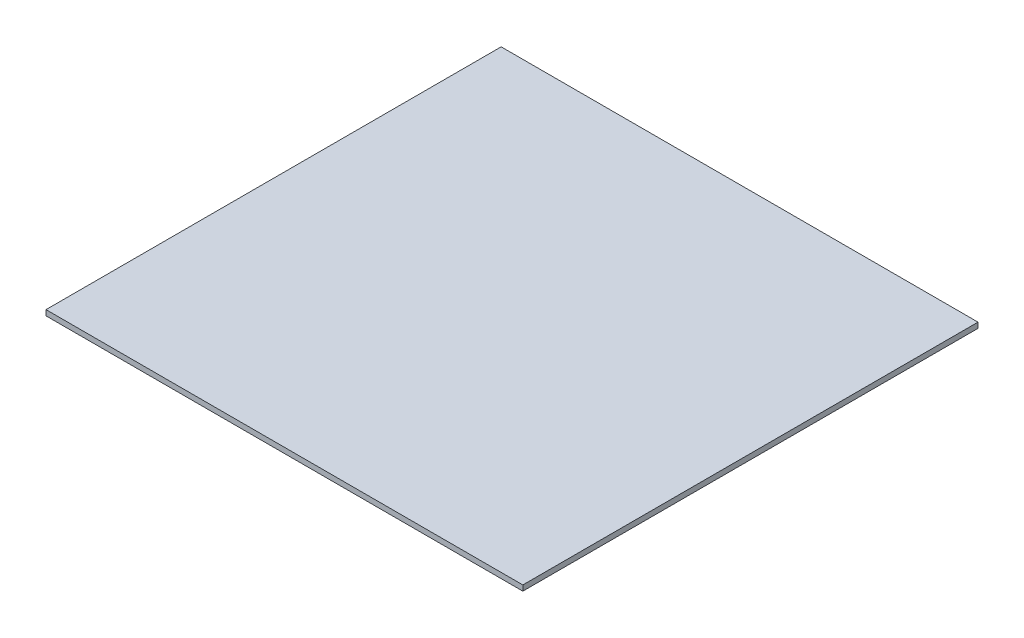
ISO-10303-21;
HEADER;
FILE_DESCRIPTION(('STEP AP214'),'2;1');
FILE_NAME('part.step','',(''),(''),'','','');
FILE_SCHEMA(('AUTOMOTIVE_DESIGN { 1 0 10303 214 1 1 1 1 }'));
ENDSEC;
DATA;
#1=APPLICATION_CONTEXT('core data for automotive mechanical design processes');
#2=APPLICATION_PROTOCOL_DEFINITION('international standard','automotive_design',2000,#1);
#3=PRODUCT_CONTEXT('',#1,'mechanical');
#4=PRODUCT('Part','Part','',(#3));
#5=PRODUCT_RELATED_PRODUCT_CATEGORY('part','',(#4));
#6=PRODUCT_DEFINITION_FORMATION('','',#4);
#7=PRODUCT_DEFINITION_CONTEXT('part definition',#1,'design');
#8=PRODUCT_DEFINITION('design','',#6,#7);
#9=PRODUCT_DEFINITION_SHAPE('','',#8);
#10=(LENGTH_UNIT() NAMED_UNIT(*) SI_UNIT(.MILLI.,.METRE.));
#11=(NAMED_UNIT(*) PLANE_ANGLE_UNIT() SI_UNIT($,.RADIAN.));
#12=(NAMED_UNIT(*) SI_UNIT($,.STERADIAN.) SOLID_ANGLE_UNIT());
#13=UNCERTAINTY_MEASURE_WITH_UNIT(LENGTH_MEASURE(1.E-05),#10,'distance_accuracy_value','');
#14=(GEOMETRIC_REPRESENTATION_CONTEXT(3) GLOBAL_UNCERTAINTY_ASSIGNED_CONTEXT((#13)) GLOBAL_UNIT_ASSIGNED_CONTEXT((#10,
#11,#12)) REPRESENTATION_CONTEXT('',''));
#15=CARTESIAN_POINT('',(0.,0.,0.));
#16=DIRECTION('',(0.,0.,1.));
#17=DIRECTION('',(1.,0.,0.));
#18=AXIS2_PLACEMENT_3D('',#15,#16,#17);
#19=CARTESIAN_POINT('',(279.4,6.35,266.7));
#20=DIRECTION('',(-1.,0.,0.));
#21=DIRECTION('',(0.,0.,1.));
#22=AXIS2_PLACEMENT_3D('',#19,#20,#21);
#23=PLANE('',#22);
#24=DIRECTION('',(0.,0.,-1.));
#25=VECTOR('',#24,1.);
#26=CARTESIAN_POINT('',(279.4,0.,266.7));
#27=LINE('',#26,#25);
#28=CARTESIAN_POINT('',(279.4,0.,266.7));
#29=VERTEX_POINT('',#28);
#30=CARTESIAN_POINT('',(279.4,0.,-266.7));
#31=VERTEX_POINT('',#30);
#32=EDGE_CURVE('E111',#29,#31,#27,.T.);
#33=ORIENTED_EDGE('',*,*,#32,.T.);
#34=DIRECTION('',(0.,-1.,0.));
#35=VECTOR('',#34,1.);
#36=CARTESIAN_POINT('',(279.4,6.35,-266.7));
#37=LINE('',#36,#35);
#38=CARTESIAN_POINT('',(279.4,6.35,-266.7));
#39=VERTEX_POINT('',#38);
#40=EDGE_CURVE('E11',#39,#31,#37,.T.);
#41=ORIENTED_EDGE('',*,*,#40,.F.);
#42=DIRECTION('',(0.,0.,-1.));
#43=VECTOR('',#42,1.);
#44=CARTESIAN_POINT('',(279.4,6.35,266.7));
#45=LINE('',#44,#43);
#46=CARTESIAN_POINT('',(279.4,6.35,266.7));
#47=VERTEX_POINT('',#46);
#48=EDGE_CURVE('E95',#47,#39,#45,.T.);
#49=ORIENTED_EDGE('',*,*,#48,.F.);
#50=DIRECTION('',(0.,-1.,0.));
#51=VECTOR('',#50,1.);
#52=CARTESIAN_POINT('',(279.4,6.35,266.7));
#53=LINE('',#52,#51);
#54=EDGE_CURVE('E107',#47,#29,#53,.T.);
#55=ORIENTED_EDGE('',*,*,#54,.T.);
#56=EDGE_LOOP('',(#33,#41,#49,#55));
#57=FACE_BOUND('',#56,.T.);
#58=ADVANCED_FACE('F43',(#57),#23,.F.);
#59=CARTESIAN_POINT('',(-279.4,6.35,-266.7));
#60=DIRECTION('',(0.,0.,1.));
#61=DIRECTION('',(1.,0.,0.));
#62=AXIS2_PLACEMENT_3D('',#59,#60,#61);
#63=PLANE('',#62);
#64=DIRECTION('',(-1.,0.,0.));
#65=VECTOR('',#64,1.);
#66=CARTESIAN_POINT('',(-279.4,0.,-266.7));
#67=LINE('',#66,#65);
#68=CARTESIAN_POINT('',(-279.4,0.,-266.7));
#69=VERTEX_POINT('',#68);
#70=EDGE_CURVE('E100',#31,#69,#67,.T.);
#71=ORIENTED_EDGE('',*,*,#70,.T.);
#72=DIRECTION('',(0.,-1.,0.));
#73=VECTOR('',#72,1.);
#74=CARTESIAN_POINT('',(-279.4,6.35,-266.7));
#75=LINE('',#74,#73);
#76=CARTESIAN_POINT('',(-279.4,6.35,-266.7));
#77=VERTEX_POINT('',#76);
#78=EDGE_CURVE('E52',#77,#69,#75,.T.);
#79=ORIENTED_EDGE('',*,*,#78,.F.);
#80=DIRECTION('',(-1.,0.,0.));
#81=VECTOR('',#80,1.);
#82=CARTESIAN_POINT('',(-279.4,6.35,-266.7));
#83=LINE('',#82,#81);
#84=EDGE_CURVE('E90',#39,#77,#83,.T.);
#85=ORIENTED_EDGE('',*,*,#84,.F.);
#86=ORIENTED_EDGE('',*,*,#40,.T.);
#87=EDGE_LOOP('',(#71,#79,#85,#86));
#88=FACE_BOUND('',#87,.T.);
#89=ADVANCED_FACE('F99',(#88),#63,.F.);
#90=CARTESIAN_POINT('',(-279.4,6.35,266.7));
#91=DIRECTION('',(1.,0.,0.));
#92=DIRECTION('',(0.,0.,-1.));
#93=AXIS2_PLACEMENT_3D('',#90,#91,#92);
#94=PLANE('',#93);
#95=DIRECTION('',(0.,0.,1.));
#96=VECTOR('',#95,1.);
#97=CARTESIAN_POINT('',(-279.4,0.,266.7));
#98=LINE('',#97,#96);
#99=CARTESIAN_POINT('',(-279.4,0.,266.7));
#100=VERTEX_POINT('',#99);
#101=EDGE_CURVE('E77',#69,#100,#98,.T.);
#102=ORIENTED_EDGE('',*,*,#101,.T.);
#103=DIRECTION('',(0.,-1.,0.));
#104=VECTOR('',#103,1.);
#105=CARTESIAN_POINT('',(-279.4,6.35,266.7));
#106=LINE('',#105,#104);
#107=CARTESIAN_POINT('',(-279.4,6.35,266.7));
#108=VERTEX_POINT('',#107);
#109=EDGE_CURVE('E102',#108,#100,#106,.T.);
#110=ORIENTED_EDGE('',*,*,#109,.F.);
#111=DIRECTION('',(0.,0.,1.));
#112=VECTOR('',#111,1.);
#113=CARTESIAN_POINT('',(-279.4,6.35,266.7));
#114=LINE('',#113,#112);
#115=EDGE_CURVE('E93',#77,#108,#114,.T.);
#116=ORIENTED_EDGE('',*,*,#115,.F.);
#117=ORIENTED_EDGE('',*,*,#78,.T.);
#118=EDGE_LOOP('',(#102,#110,#116,#117));
#119=FACE_BOUND('',#118,.T.);
#120=ADVANCED_FACE('F103',(#119),#94,.F.);
#121=CARTESIAN_POINT('',(-279.4,6.35,266.7));
#122=DIRECTION('',(0.,0.,-1.));
#123=DIRECTION('',(-1.,0.,0.));
#124=AXIS2_PLACEMENT_3D('',#121,#122,#123);
#125=PLANE('',#124);
#126=DIRECTION('',(1.,0.,0.));
#127=VECTOR('',#126,1.);
#128=CARTESIAN_POINT('',(-279.4,0.,266.7));
#129=LINE('',#128,#127);
#130=EDGE_CURVE('E83',#100,#29,#129,.T.);
#131=ORIENTED_EDGE('',*,*,#130,.T.);
#132=ORIENTED_EDGE('',*,*,#54,.F.);
#133=DIRECTION('',(1.,0.,0.));
#134=VECTOR('',#133,1.);
#135=CARTESIAN_POINT('',(-279.4,6.35,266.7));
#136=LINE('',#135,#134);
#137=EDGE_CURVE('E60',#108,#47,#136,.T.);
#138=ORIENTED_EDGE('',*,*,#137,.F.);
#139=ORIENTED_EDGE('',*,*,#109,.T.);
#140=EDGE_LOOP('',(#131,#132,#138,#139));
#141=FACE_BOUND('',#140,.T.);
#142=ADVANCED_FACE('F124',(#141),#125,.F.);
#143=CARTESIAN_POINT('',(0.,6.35,0.));
#144=DIRECTION('',(0.,-1.,0.));
#145=DIRECTION('',(0.,0.,-1.));
#146=AXIS2_PLACEMENT_3D('',#143,#144,#145);
#147=PLANE('',#146);
#148=ORIENTED_EDGE('',*,*,#48,.T.);
#149=ORIENTED_EDGE('',*,*,#84,.T.);
#150=ORIENTED_EDGE('',*,*,#115,.T.);
#151=ORIENTED_EDGE('',*,*,#137,.T.);
#152=EDGE_LOOP('',(#148,#149,#150,#151));
#153=FACE_BOUND('',#152,.T.);
#154=ADVANCED_FACE('F91',(#153),#147,.F.);
#155=CARTESIAN_POINT('',(0.,0.,0.));
#156=DIRECTION('',(0.,-1.,0.));
#157=DIRECTION('',(0.,0.,-1.));
#158=AXIS2_PLACEMENT_3D('',#155,#156,#157);
#159=PLANE('',#158);
#160=ORIENTED_EDGE('',*,*,#32,.F.);
#161=ORIENTED_EDGE('',*,*,#130,.F.);
#162=ORIENTED_EDGE('',*,*,#101,.F.);
#163=ORIENTED_EDGE('',*,*,#70,.F.);
#164=EDGE_LOOP('',(#160,#161,#162,#163));
#165=FACE_BOUND('',#164,.T.);
#166=ADVANCED_FACE('F127',(#165),#159,.T.);
#167=CLOSED_SHELL('',(#58,#89,#120,#142,#154,#166));
#168=MANIFOLD_SOLID_BREP('B2',#167);
#169=ADVANCED_BREP_SHAPE_REPRESENTATION('',(#18,#168),#14);
#170=SHAPE_DEFINITION_REPRESENTATION(#9,#169);
ENDSEC;
END-ISO-10303-21;
